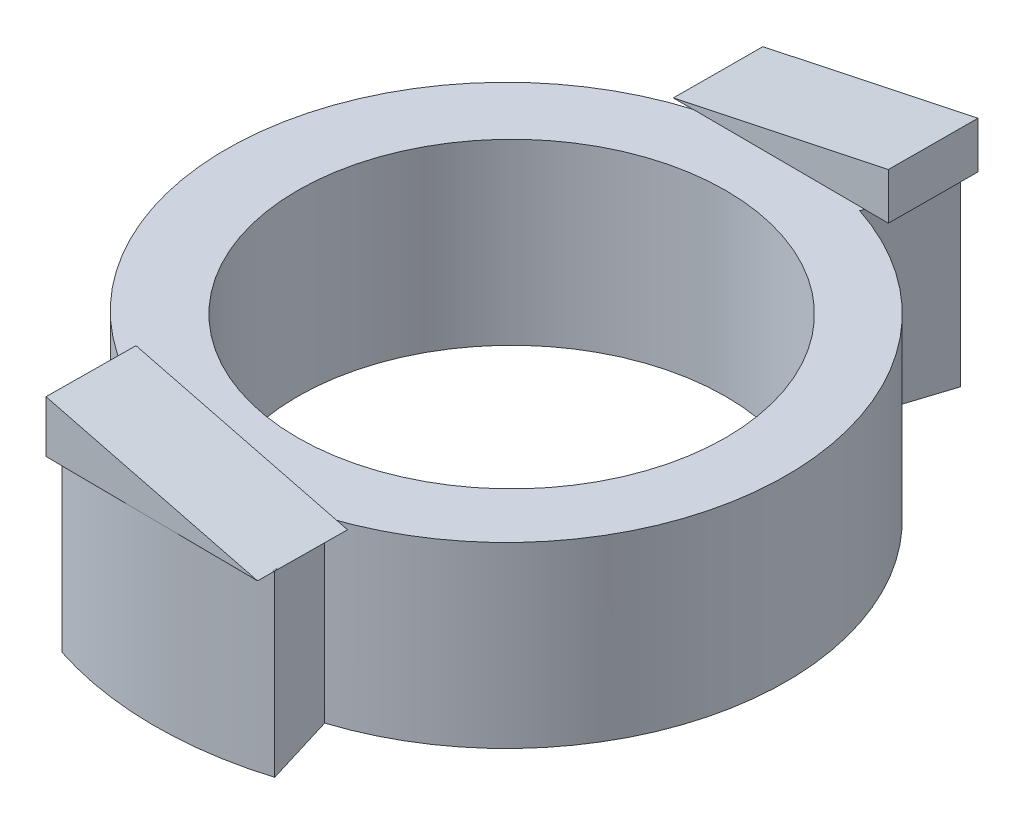
ISO-10303-21;
HEADER;
FILE_DESCRIPTION(('STEP AP214'),'2;1');
FILE_NAME('part.step','',(''),(''),'','','');
FILE_SCHEMA(('AUTOMOTIVE_DESIGN { 1 0 10303 214 1 1 1 1 }'));
ENDSEC;
DATA;
#1=APPLICATION_CONTEXT('core data for automotive mechanical design processes');
#2=APPLICATION_PROTOCOL_DEFINITION('international standard','automotive_design',2000,#1);
#3=PRODUCT_CONTEXT('',#1,'mechanical');
#4=PRODUCT('Part','Part','',(#3));
#5=PRODUCT_RELATED_PRODUCT_CATEGORY('part','',(#4));
#6=PRODUCT_DEFINITION_FORMATION('','',#4);
#7=PRODUCT_DEFINITION_CONTEXT('part definition',#1,'design');
#8=PRODUCT_DEFINITION('design','',#6,#7);
#9=PRODUCT_DEFINITION_SHAPE('','',#8);
#10=(LENGTH_UNIT() NAMED_UNIT(*) SI_UNIT(.MILLI.,.METRE.));
#11=(NAMED_UNIT(*) PLANE_ANGLE_UNIT() SI_UNIT($,.RADIAN.));
#12=(NAMED_UNIT(*) SI_UNIT($,.STERADIAN.) SOLID_ANGLE_UNIT());
#13=UNCERTAINTY_MEASURE_WITH_UNIT(LENGTH_MEASURE(1.E-05),#10,'distance_accuracy_value','');
#14=(GEOMETRIC_REPRESENTATION_CONTEXT(3) GLOBAL_UNCERTAINTY_ASSIGNED_CONTEXT((#13)) GLOBAL_UNIT_ASSIGNED_CONTEXT((#10,
#11,#12)) REPRESENTATION_CONTEXT('',''));
#15=CARTESIAN_POINT('',(0.,0.,0.));
#16=DIRECTION('',(0.,0.,1.));
#17=DIRECTION('',(1.,0.,0.));
#18=AXIS2_PLACEMENT_3D('',#15,#16,#17);
#19=CARTESIAN_POINT('',(-0.312313506761525,10.,-0.00240096295319026));
#20=DIRECTION('',(0.,1.,0.));
#21=DIRECTION('',(0.,0.,1.));
#22=AXIS2_PLACEMENT_3D('',#19,#20,#21);
#23=PLANE('',#22);
#24=CARTESIAN_POINT('',(0.,10.,0.));
#25=DIRECTION('',(0.,1.,0.));
#26=DIRECTION('',(0.,0.,1.));
#27=AXIS2_PLACEMENT_3D('',#24,#25,#26);
#28=CIRCLE('',#27,12.);
#29=CARTESIAN_POINT('',(0.,10.,12.));
#30=VERTEX_POINT('',#29);
#31=EDGE_CURVE('E313',#30,#30,#28,.T.);
#32=ORIENTED_EDGE('',*,*,#31,.F.);
#33=EDGE_LOOP('',(#32));
#34=FACE_BOUND('',#33,.T.);
#35=DIRECTION('',(0.305424491307193,0.,-0.952216299014957));
#36=VECTOR('',#35,1.);
#37=CARTESIAN_POINT('',(6.10848982614386,10.,-19.0443259802991));
#38=LINE('',#37,#36);
#39=CARTESIAN_POINT('',(4.73625087105242,10.,-14.7661219188341));
#40=VERTEX_POINT('',#39);
#41=CARTESIAN_POINT('',(4.80446415167743,10.,-14.9787892047561));
#42=VERTEX_POINT('',#41);
#43=EDGE_CURVE('E333',#40,#42,#38,.T.);
#44=ORIENTED_EDGE('',*,*,#43,.T.);
#45=DIRECTION('',(-0.999990118191045,0.,-0.00444561809660753));
#46=VECTOR('',#45,1.);
#47=CARTESIAN_POINT('',(-0.245633736556971,10.,-15.0012402331745));
#48=LINE('',#47,#46);
#49=CARTESIAN_POINT('',(-4.84503233375843,10.,-15.0216876048687));
#50=VERTEX_POINT('',#49);
#51=EDGE_CURVE('E252',#42,#50,#48,.T.);
#52=ORIENTED_EDGE('',*,*,#51,.T.);
#53=CARTESIAN_POINT('',(-0.312313506761525,10.,-0.00240096295319026));
#54=DIRECTION('',(0.,1.,0.));
#55=DIRECTION('',(0.,0.,1.));
#56=AXIS2_PLACEMENT_3D('',#53,#54,#55);
#57=CIRCLE('',#56,15.6883559112048);
#58=CARTESIAN_POINT('',(-5.04693820758331,10.,14.9544650235763));
#59=VERTEX_POINT('',#58);
#60=EDGE_CURVE('E319',#50,#59,#57,.T.);
#61=ORIENTED_EDGE('',*,*,#60,.T.);
#62=DIRECTION('',(0.999958172310143,0.,0.00914623584638644));
#63=VECTOR('',#62,1.);
#64=CARTESIAN_POINT('',(-0.449502877153635,10.,14.9965160102925));
#65=LINE('',#64,#63);
#66=CARTESIAN_POINT('',(4.75658191495235,10.,15.0441340813914));
#67=VERTEX_POINT('',#66);
#68=EDGE_CURVE('E280',#59,#67,#65,.T.);
#69=ORIENTED_EDGE('',*,*,#68,.T.);
#70=CARTESIAN_POINT('',(-0.153904493718721,10.,0.142348173982245));
#71=DIRECTION('',(0.,1.,0.));
#72=DIRECTION('',(0.,0.,-1.));
#73=AXIS2_PLACEMENT_3D('',#70,#71,#72);
#74=CIRCLE('',#73,15.69);
#75=EDGE_CURVE('E331',#67,#40,#74,.T.);
#76=ORIENTED_EDGE('',*,*,#75,.T.);
#77=EDGE_LOOP('',(#44,#52,#61,#69,#76));
#78=FACE_BOUND('',#77,.T.);
#79=ADVANCED_FACE('F35',(#34,#78),#23,.T.);
#80=DIRECTION('',(-0.00914623584638639,0.,0.999958172310143));
#81=VECTOR('',#80,1.);
#82=CARTESIAN_POINT('',(-5.97093127645346,10.,-0.05415818052419));
#83=LINE('',#82,#81);
#84=CARTESIAN_POINT('',(-6.14390272735196,10.,18.8568144651936));
#85=VERTEX_POINT('',#84);
#86=CARTESIAN_POINT('',(-6.14550885445566,10.,19.0324123778308));
#87=VERTEX_POINT('',#86);
#88=EDGE_CURVE('E307',#85,#87,#83,.T.);
#89=ORIENTED_EDGE('',*,*,#88,.F.);
#90=DIRECTION('',(-0.309790043384997,0.,0.950804990005585));
#91=VECTOR('',#90,1.);
#92=CARTESIAN_POINT('',(-6.19580086769995,10.,19.0160998001117));
#93=LINE('',#92,#91);
#94=CARTESIAN_POINT('',(-6.19580086769995,10.,19.0160998001117));
#95=VERTEX_POINT('',#94);
#96=EDGE_CURVE('E321',#85,#95,#93,.T.);
#97=ORIENTED_EDGE('',*,*,#96,.T.);
#98=CARTESIAN_POINT('',(0.,10.,0.));
#99=DIRECTION('',(0.,1.,0.));
#100=DIRECTION('',(0.,0.,1.));
#101=AXIS2_PLACEMENT_3D('',#98,#99,#100);
#102=CIRCLE('',#101,20.);
#103=EDGE_CURVE('E325',#95,#87,#102,.T.);
#104=ORIENTED_EDGE('',*,*,#103,.T.);
#105=EDGE_LOOP('',(#89,#97,#104));
#106=FACE_BOUND('',#105,.T.);
#107=ADVANCED_FACE('F448',(#106),#23,.T.);
#108=DIRECTION('',(0.00914623584638639,0.,-0.999958172310143));
#109=VECTOR('',#108,1.);
#110=CARTESIAN_POINT('',(5.93113391954824,10.,0.0547054683324496));
#111=LINE('',#110,#109);
#112=CARTESIAN_POINT('',(5.75644290922359,10.,19.153677585071));
#113=VERTEX_POINT('',#112);
#114=CARTESIAN_POINT('',(5.75931514236419,10.,18.8396562707332));
#115=VERTEX_POINT('',#114);
#116=EDGE_CURVE('E302',#113,#115,#111,.T.);
#117=ORIENTED_EDGE('',*,*,#116,.F.);
#118=CARTESIAN_POINT('',(5.8469273477541,10.,19.1262500399343));
#119=VERTEX_POINT('',#118);
#120=EDGE_CURVE('E324',#113,#119,#102,.T.);
#121=ORIENTED_EDGE('',*,*,#120,.T.);
#122=DIRECTION('',(-0.292346367387705,0.,-0.956312501996713));
#123=VECTOR('',#122,1.);
#124=CARTESIAN_POINT('',(5.8469273477541,10.,19.1262500399343));
#125=LINE('',#124,#123);
#126=EDGE_CURVE('E328',#119,#115,#125,.T.);
#127=ORIENTED_EDGE('',*,*,#126,.T.);
#128=EDGE_LOOP('',(#117,#121,#127));
#129=FACE_BOUND('',#128,.T.);
#130=ADVANCED_FACE('F480',(#129),#23,.T.);
#131=CARTESIAN_POINT('',(-0.312313506761525,0.,-0.00240096295319026));
#132=DIRECTION('',(0.,1.,0.));
#133=DIRECTION('',(0.,0.,1.));
#134=AXIS2_PLACEMENT_3D('',#131,#132,#133);
#135=PLANE('',#134);
#136=CARTESIAN_POINT('',(-0.312313506761525,0.,-0.00240096295319026));
#137=DIRECTION('',(0.,1.,0.));
#138=DIRECTION('',(0.,0.,1.));
#139=AXIS2_PLACEMENT_3D('',#136,#137,#138);
#140=CIRCLE('',#139,15.6883559112048);
#141=CARTESIAN_POINT('',(-4.65723572047331,0.,-15.0770871007615));
#142=VERTEX_POINT('',#141);
#143=CARTESIAN_POINT('',(-4.88848688461526,0.,15.0037027422881));
#144=VERTEX_POINT('',#143);
#145=EDGE_CURVE('E316',#142,#144,#140,.T.);
#146=ORIENTED_EDGE('',*,*,#145,.F.);
#147=DIRECTION('',(0.303707562580679,0.,0.952765299762383));
#148=VECTOR('',#147,1.);
#149=CARTESIAN_POINT('',(-5.93892244845055,0.,-19.0978847035814));
#150=LINE('',#149,#148);
#151=CARTESIAN_POINT('',(-5.93892244845055,0.,-19.0978847035814));
#152=VERTEX_POINT('',#151);
#153=EDGE_CURVE('E322',#152,#142,#150,.T.);
#154=ORIENTED_EDGE('',*,*,#153,.F.);
#155=CARTESIAN_POINT('',(0.,0.,0.));
#156=DIRECTION('',(0.,1.,0.));
#157=DIRECTION('',(0.,0.,1.));
#158=AXIS2_PLACEMENT_3D('',#155,#156,#157);
#159=CIRCLE('',#158,20.);
#160=CARTESIAN_POINT('',(6.10848982614386,0.,-19.0443259802991));
#161=VERTEX_POINT('',#160);
#162=EDGE_CURVE('E356',#161,#152,#159,.T.);
#163=ORIENTED_EDGE('',*,*,#162,.F.);
#164=DIRECTION('',(0.305424491307193,0.,-0.952216299014957));
#165=VECTOR('',#164,1.);
#166=CARTESIAN_POINT('',(6.10848982614386,0.,-19.0443259802991));
#167=LINE('',#166,#165);
#168=CARTESIAN_POINT('',(4.73625087105242,0.,-14.7661219188341));
#169=VERTEX_POINT('',#168);
#170=EDGE_CURVE('E353',#169,#161,#167,.T.);
#171=ORIENTED_EDGE('',*,*,#170,.F.);
#172=CARTESIAN_POINT('',(-0.153904493718721,0.,0.142348173982245));
#173=DIRECTION('',(0.,1.,0.));
#174=DIRECTION('',(0.,0.,-1.));
#175=AXIS2_PLACEMENT_3D('',#172,#173,#174);
#176=CIRCLE('',#175,15.69);
#177=CARTESIAN_POINT('',(4.61322567737798,0.,15.0906112815081));
#178=VERTEX_POINT('',#177);
#179=EDGE_CURVE('E351',#178,#169,#176,.T.);
#180=ORIENTED_EDGE('',*,*,#179,.F.);
#181=DIRECTION('',(-0.292346367387705,0.,-0.956312501996713));
#182=VECTOR('',#181,1.);
#183=CARTESIAN_POINT('',(5.8469273477541,0.,19.1262500399343));
#184=LINE('',#183,#182);
#185=CARTESIAN_POINT('',(5.8469273477541,0.,19.1262500399343));
#186=VERTEX_POINT('',#185);
#187=EDGE_CURVE('E348',#186,#178,#184,.T.);
#188=ORIENTED_EDGE('',*,*,#187,.F.);
#189=CARTESIAN_POINT('',(0.,0.,0.));
#190=DIRECTION('',(0.,1.,0.));
#191=DIRECTION('',(0.,0.,1.));
#192=AXIS2_PLACEMENT_3D('',#189,#190,#191);
#193=CIRCLE('',#192,20.);
#194=CARTESIAN_POINT('',(-6.19580086769995,0.,19.0160998001117));
#195=VERTEX_POINT('',#194);
#196=EDGE_CURVE('E346',#195,#186,#193,.T.);
#197=ORIENTED_EDGE('',*,*,#196,.F.);
#198=DIRECTION('',(-0.309790043384997,0.,0.950804990005585));
#199=VECTOR('',#198,1.);
#200=CARTESIAN_POINT('',(-6.19580086769995,0.,19.0160998001117));
#201=LINE('',#200,#199);
#202=EDGE_CURVE('E344',#144,#195,#201,.T.);
#203=ORIENTED_EDGE('',*,*,#202,.F.);
#204=EDGE_LOOP('',(#146,#154,#163,#171,#180,#188,#197,#203));
#205=FACE_BOUND('',#204,.T.);
#206=CARTESIAN_POINT('',(0.,0.,0.));
#207=DIRECTION('',(0.,1.,0.));
#208=DIRECTION('',(0.,0.,1.));
#209=AXIS2_PLACEMENT_3D('',#206,#207,#208);
#210=CIRCLE('',#209,12.);
#211=CARTESIAN_POINT('',(0.,0.,12.));
#212=VERTEX_POINT('',#211);
#213=EDGE_CURVE('E312',#212,#212,#210,.T.);
#214=ORIENTED_EDGE('',*,*,#213,.T.);
#215=EDGE_LOOP('',(#214));
#216=FACE_BOUND('',#215,.T.);
#217=ADVANCED_FACE('F433',(#205,#216),#135,.F.);
#218=CARTESIAN_POINT('',(-0.312313506761525,10.,-0.00240096295319026));
#219=DIRECTION('',(0.,-1.,0.));
#220=DIRECTION('',(0.,0.,-1.));
#221=AXIS2_PLACEMENT_3D('',#218,#219,#220);
#222=CYLINDRICAL_SURFACE('',#221,15.6883559112048);
#223=DIRECTION('',(0.,-1.,0.));
#224=VECTOR('',#223,1.);
#225=CARTESIAN_POINT('',(-4.84503233375843,10.,-15.0216876048687));
#226=LINE('',#225,#224);
#227=CARTESIAN_POINT('',(-4.84503233375843,9.99252029522689,-15.0216876048687));
#228=VERTEX_POINT('',#227);
#229=EDGE_CURVE('E255',#228,#50,#226,.F.);
#230=ORIENTED_EDGE('',*,*,#229,.F.);
#231=CARTESIAN_POINT('',(-0.312313506761525,9.99252029522689,-0.00240096295319026));
#232=DIRECTION('',(0.,-1.,0.));
#233=DIRECTION('',(0.,0.,-1.));
#234=AXIS2_PLACEMENT_3D('',#231,#232,#233);
#235=CIRCLE('',#234,15.6883559112048);
#236=CARTESIAN_POINT('',(-4.65723572047331,9.99252029522689,-15.0770871007615));
#237=VERTEX_POINT('',#236);
#238=EDGE_CURVE('E245',#228,#237,#235,.T.);
#239=ORIENTED_EDGE('',*,*,#238,.T.);
#240=DIRECTION('',(0.,-1.,0.));
#241=VECTOR('',#240,1.);
#242=CARTESIAN_POINT('',(-4.65723572047331,10.,-15.0770871007615));
#243=LINE('',#242,#241);
#244=EDGE_CURVE('E341',#237,#142,#243,.T.);
#245=ORIENTED_EDGE('',*,*,#244,.T.);
#246=ORIENTED_EDGE('',*,*,#145,.T.);
#247=DIRECTION('',(0.,-1.,0.));
#248=VECTOR('',#247,1.);
#249=CARTESIAN_POINT('',(-4.88848688461526,10.,15.0037027422881));
#250=LINE('',#249,#248);
#251=CARTESIAN_POINT('',(-4.88848688461526,9.98499083463624,15.0037027422881));
#252=VERTEX_POINT('',#251);
#253=EDGE_CURVE('E379',#252,#144,#250,.T.);
#254=ORIENTED_EDGE('',*,*,#253,.F.);
#255=CARTESIAN_POINT('',(-0.312313506761525,9.98499083463624,-0.00240096295319026));
#256=DIRECTION('',(0.,-1.,0.));
#257=DIRECTION('',(0.,0.,-1.));
#258=AXIS2_PLACEMENT_3D('',#255,#256,#257);
#259=CIRCLE('',#258,15.6883559112048);
#260=CARTESIAN_POINT('',(-5.04693820758331,9.98499083463624,14.9544650235763));
#261=VERTEX_POINT('',#260);
#262=EDGE_CURVE('E300',#252,#261,#259,.T.);
#263=ORIENTED_EDGE('',*,*,#262,.T.);
#264=DIRECTION('',(0.,-1.,0.));
#265=VECTOR('',#264,1.);
#266=CARTESIAN_POINT('',(-5.04693820758331,10.,14.9544650235763));
#267=LINE('',#266,#265);
#268=EDGE_CURVE('E290',#59,#261,#267,.T.);
#269=ORIENTED_EDGE('',*,*,#268,.F.);
#270=ORIENTED_EDGE('',*,*,#60,.F.);
#271=EDGE_LOOP('',(#230,#239,#245,#246,#254,#263,#269,#270));
#272=FACE_BOUND('',#271,.T.);
#273=ADVANCED_FACE('F37',(#272),#222,.T.);
#274=CARTESIAN_POINT('',(-6.19580086769995,10.,19.0160998001117));
#275=DIRECTION('',(0.950804990005586,0.,0.309790043384997));
#276=DIRECTION('',(0.309790043384997,0.,-0.950804990005586));
#277=AXIS2_PLACEMENT_3D('',#274,#275,#276);
#278=PLANE('',#277);
#279=ORIENTED_EDGE('',*,*,#96,.F.);
#280=DIRECTION('',(0.,-1.,0.));
#281=VECTOR('',#280,1.);
#282=CARTESIAN_POINT('',(-6.14390272735196,10.,18.8568144651936));
#283=LINE('',#282,#281);
#284=CARTESIAN_POINT('',(-6.14390272735196,9.98499083463624,18.8568144651936));
#285=VERTEX_POINT('',#284);
#286=EDGE_CURVE('E310',#85,#285,#283,.T.);
#287=ORIENTED_EDGE('',*,*,#286,.T.);
#288=DIRECTION('',(0.309790043384997,0.,-0.950804990005586));
#289=VECTOR('',#288,1.);
#290=CARTESIAN_POINT('',(-6.19580086769995,9.98499083463624,19.0160998001117));
#291=LINE('',#290,#289);
#292=EDGE_CURVE('E298',#285,#252,#291,.T.);
#293=ORIENTED_EDGE('',*,*,#292,.T.);
#294=ORIENTED_EDGE('',*,*,#253,.T.);
#295=ORIENTED_EDGE('',*,*,#202,.T.);
#296=DIRECTION('',(0.,-1.,0.));
#297=VECTOR('',#296,1.);
#298=CARTESIAN_POINT('',(-6.19580086769995,10.,19.0160998001117));
#299=LINE('',#298,#297);
#300=EDGE_CURVE('E376',#95,#195,#299,.T.);
#301=ORIENTED_EDGE('',*,*,#300,.F.);
#302=EDGE_LOOP('',(#279,#287,#293,#294,#295,#301));
#303=FACE_BOUND('',#302,.T.);
#304=ADVANCED_FACE('F440',(#303),#278,.F.);
#305=CARTESIAN_POINT('',(0.,10.,0.));
#306=DIRECTION('',(0.,-1.,0.));
#307=DIRECTION('',(0.,0.,-1.));
#308=AXIS2_PLACEMENT_3D('',#305,#306,#307);
#309=CYLINDRICAL_SURFACE('',#308,20.);
#310=ORIENTED_EDGE('',*,*,#120,.F.);
#311=CARTESIAN_POINT('',(0.,11.4378516574186,0.));
#312=DIRECTION('',(0.235580863772007,0.971852362037639,0.00215476826993311));
#313=DIRECTION('',(0.971811711698453,-0.235590717987492,0.00888879091106393));
#314=AXIS2_PLACEMENT_3D('',#311,#312,#313);
#315=ELLIPSE('',#314,20.5792574893443,20.);
#316=CARTESIAN_POINT('',(5.81853258035443,9.98499083463624,19.1349073321862));
#317=VERTEX_POINT('',#316);
#318=EDGE_CURVE('E305',#113,#317,#315,.T.);
#319=ORIENTED_EDGE('',*,*,#318,.T.);
#320=CARTESIAN_POINT('',(0.,9.98499083463624,0.));
#321=DIRECTION('',(0.,-1.,0.));
#322=DIRECTION('',(0.,0.,-1.));
#323=AXIS2_PLACEMENT_3D('',#320,#321,#322);
#324=CIRCLE('',#323,20.);
#325=CARTESIAN_POINT('',(-0.182924716927729,9.98499083463624,19.9991634462029));
#326=VERTEX_POINT('',#325);
#327=EDGE_CURVE('E297',#317,#326,#324,.T.);
#328=ORIENTED_EDGE('',*,*,#327,.T.);
#329=CARTESIAN_POINT('',(-6.14550885445566,9.98499083463624,19.0324123778308));
#330=VERTEX_POINT('',#329);
#331=EDGE_CURVE('E295',#326,#330,#324,.T.);
#332=ORIENTED_EDGE('',*,*,#331,.T.);
#333=DIRECTION('',(0.,-1.,0.));
#334=VECTOR('',#333,1.);
#335=CARTESIAN_POINT('',(-6.14550885445566,10.,19.0324123778308));
#336=LINE('',#335,#334);
#337=EDGE_CURVE('E388',#330,#87,#336,.F.);
#338=ORIENTED_EDGE('',*,*,#337,.T.);
#339=ORIENTED_EDGE('',*,*,#103,.F.);
#340=ORIENTED_EDGE('',*,*,#300,.T.);
#341=ORIENTED_EDGE('',*,*,#196,.T.);
#342=DIRECTION('',(0.,-1.,0.));
#343=VECTOR('',#342,1.);
#344=CARTESIAN_POINT('',(5.8469273477541,10.,19.1262500399343));
#345=LINE('',#344,#343);
#346=EDGE_CURVE('E373',#119,#186,#345,.T.);
#347=ORIENTED_EDGE('',*,*,#346,.F.);
#348=EDGE_LOOP('',(#310,#319,#328,#332,#338,#339,#340,#341,#347));
#349=FACE_BOUND('',#348,.T.);
#350=ADVANCED_FACE('F444',(#349),#309,.T.);
#351=CARTESIAN_POINT('',(5.8469273477541,10.,19.1262500399343));
#352=DIRECTION('',(-0.956312501996713,0.,0.292346367387705));
#353=DIRECTION('',(0.292346367387705,0.,0.956312501996713));
#354=AXIS2_PLACEMENT_3D('',#351,#352,#353);
#355=PLANE('',#354);
#356=DIRECTION('',(0.292346367387705,0.,0.956312501996713));
#357=VECTOR('',#356,1.);
#358=CARTESIAN_POINT('',(5.8469273477541,9.98499083463624,19.1262500399343));
#359=LINE('',#358,#357);
#360=CARTESIAN_POINT('',(4.61322567737798,9.98499083463624,15.0906112815081));
#361=VERTEX_POINT('',#360);
#362=CARTESIAN_POINT('',(5.8194343576586,9.98499083463624,19.036315999089));
#363=VERTEX_POINT('',#362);
#364=EDGE_CURVE('E293',#361,#363,#359,.T.);
#365=ORIENTED_EDGE('',*,*,#364,.T.);
#366=DIRECTION('',(-0.291570801501188,0.0727926063829267,-0.953775499878213));
#367=VECTOR('',#366,1.);
#368=CARTESIAN_POINT('',(5.84646311139417,9.97824292496365,19.1247314473181));
#369=LINE('',#368,#367);
#370=EDGE_CURVE('E386',#363,#115,#369,.T.);
#371=ORIENTED_EDGE('',*,*,#370,.T.);
#372=ORIENTED_EDGE('',*,*,#126,.F.);
#373=ORIENTED_EDGE('',*,*,#346,.T.);
#374=ORIENTED_EDGE('',*,*,#187,.T.);
#375=DIRECTION('',(0.,-1.,0.));
#376=VECTOR('',#375,1.);
#377=CARTESIAN_POINT('',(4.61322567737798,10.,15.0906112815081));
#378=LINE('',#377,#376);
#379=EDGE_CURVE('E371',#361,#178,#378,.T.);
#380=ORIENTED_EDGE('',*,*,#379,.F.);
#381=EDGE_LOOP('',(#365,#371,#372,#373,#374,#380));
#382=FACE_BOUND('',#381,.T.);
#383=ADVANCED_FACE('F473',(#382),#355,.F.);
#384=CARTESIAN_POINT('',(-0.153904493718721,10.,0.142348173982245));
#385=DIRECTION('',(0.,-1.,0.));
#386=DIRECTION('',(0.,0.,-1.));
#387=AXIS2_PLACEMENT_3D('',#384,#385,#386);
#388=CYLINDRICAL_SURFACE('',#387,15.69);
#389=DIRECTION('',(0.,-1.,0.));
#390=VECTOR('',#389,1.);
#391=CARTESIAN_POINT('',(4.75658191495235,10.,15.0441340813914));
#392=LINE('',#391,#390);
#393=CARTESIAN_POINT('',(4.75658191495235,9.98499083463624,15.0441340813914));
#394=VERTEX_POINT('',#393);
#395=EDGE_CURVE('E381',#394,#67,#392,.F.);
#396=ORIENTED_EDGE('',*,*,#395,.F.);
#397=CARTESIAN_POINT('',(-0.153904493718721,9.98499083463624,0.142348173982245));
#398=DIRECTION('',(0.,-1.,0.));
#399=DIRECTION('',(0.,0.,-1.));
#400=AXIS2_PLACEMENT_3D('',#397,#398,#399);
#401=CIRCLE('',#400,15.69);
#402=EDGE_CURVE('E384',#394,#361,#401,.T.);
#403=ORIENTED_EDGE('',*,*,#402,.T.);
#404=ORIENTED_EDGE('',*,*,#379,.T.);
#405=ORIENTED_EDGE('',*,*,#179,.T.);
#406=DIRECTION('',(0.,-1.,0.));
#407=VECTOR('',#406,1.);
#408=CARTESIAN_POINT('',(4.73625087105242,10.,-14.7661219188341));
#409=LINE('',#408,#407);
#410=EDGE_CURVE('E368',#40,#169,#409,.T.);
#411=ORIENTED_EDGE('',*,*,#410,.F.);
#412=ORIENTED_EDGE('',*,*,#75,.F.);
#413=EDGE_LOOP('',(#396,#403,#404,#405,#411,#412));
#414=FACE_BOUND('',#413,.T.);
#415=ADVANCED_FACE('F464',(#414),#388,.T.);
#416=CARTESIAN_POINT('',(6.10848982614386,10.,-19.0443259802991));
#417=DIRECTION('',(-0.952216299014957,0.,-0.305424491307193));
#418=DIRECTION('',(-0.305424491307193,0.,0.952216299014957));
#419=AXIS2_PLACEMENT_3D('',#416,#417,#418);
#420=PLANE('',#419);
#421=DIRECTION('',(0.,-1.,0.));
#422=VECTOR('',#421,1.);
#423=CARTESIAN_POINT('',(6.10848982614386,10.,-19.0443259802991));
#424=LINE('',#423,#422);
#425=CARTESIAN_POINT('',(6.10848982614386,9.99252029522689,-19.0443259802991));
#426=VERTEX_POINT('',#425);
#427=EDGE_CURVE('E366',#426,#161,#424,.T.);
#428=ORIENTED_EDGE('',*,*,#427,.F.);
#429=DIRECTION('',(-0.305424491307193,0.,0.952216299014957));
#430=VECTOR('',#429,1.);
#431=CARTESIAN_POINT('',(6.10848982614386,9.99252029522689,-19.0443259802991));
#432=LINE('',#431,#430);
#433=CARTESIAN_POINT('',(4.80446415167743,9.99252029522689,-14.9787892047561));
#434=VERTEX_POINT('',#433);
#435=EDGE_CURVE('E243',#426,#434,#432,.T.);
#436=ORIENTED_EDGE('',*,*,#435,.T.);
#437=DIRECTION('',(0.,-1.,0.));
#438=VECTOR('',#437,1.);
#439=CARTESIAN_POINT('',(4.80446415167743,10.,-14.9787892047561));
#440=LINE('',#439,#438);
#441=EDGE_CURVE('E11',#42,#434,#440,.T.);
#442=ORIENTED_EDGE('',*,*,#441,.F.);
#443=ORIENTED_EDGE('',*,*,#43,.F.);
#444=ORIENTED_EDGE('',*,*,#410,.T.);
#445=ORIENTED_EDGE('',*,*,#170,.T.);
#446=EDGE_LOOP('',(#428,#436,#442,#443,#444,#445));
#447=FACE_BOUND('',#446,.T.);
#448=ADVANCED_FACE('F419',(#447),#420,.F.);
#449=CARTESIAN_POINT('',(0.,10.,0.));
#450=DIRECTION('',(0.,-1.,0.));
#451=DIRECTION('',(0.,0.,-1.));
#452=AXIS2_PLACEMENT_3D('',#449,#450,#451);
#453=CYLINDRICAL_SURFACE('',#452,20.);
#454=CARTESIAN_POINT('',(0.,9.99252029522689,0.));
#455=DIRECTION('',(0.,-1.,0.));
#456=DIRECTION('',(0.,0.,-1.));
#457=AXIS2_PLACEMENT_3D('',#454,#455,#456);
#458=CIRCLE('',#457,20.);
#459=CARTESIAN_POINT('',(-5.93892244845055,9.99252029522689,-19.0978847035814));
#460=VERTEX_POINT('',#459);
#461=CARTESIAN_POINT('',(0.0889123619321518,9.99252029522689,-19.9998023638209));
#462=VERTEX_POINT('',#461);
#463=EDGE_CURVE('E50',#460,#462,#458,.T.);
#464=ORIENTED_EDGE('',*,*,#463,.T.);
#465=EDGE_CURVE('E242',#462,#426,#458,.T.);
#466=ORIENTED_EDGE('',*,*,#465,.T.);
#467=ORIENTED_EDGE('',*,*,#427,.T.);
#468=ORIENTED_EDGE('',*,*,#162,.T.);
#469=DIRECTION('',(0.,-1.,0.));
#470=VECTOR('',#469,1.);
#471=CARTESIAN_POINT('',(-5.93892244845055,10.,-19.0978847035814));
#472=LINE('',#471,#470);
#473=EDGE_CURVE('E362',#460,#152,#472,.T.);
#474=ORIENTED_EDGE('',*,*,#473,.F.);
#475=EDGE_LOOP('',(#464,#466,#467,#468,#474));
#476=FACE_BOUND('',#475,.T.);
#477=ADVANCED_FACE('F422',(#476),#453,.T.);
#478=CARTESIAN_POINT('',(-5.93892244845055,10.,-19.0978847035814));
#479=DIRECTION('',(0.952765299762383,0.,-0.303707562580679));
#480=DIRECTION('',(-0.303707562580679,0.,-0.952765299762383));
#481=AXIS2_PLACEMENT_3D('',#478,#479,#480);
#482=PLANE('',#481);
#483=ORIENTED_EDGE('',*,*,#244,.F.);
#484=DIRECTION('',(-0.303707562580679,0.,-0.952765299762383));
#485=VECTOR('',#484,1.);
#486=CARTESIAN_POINT('',(-5.93892244845055,9.99252029522689,-19.0978847035814));
#487=LINE('',#486,#485);
#488=EDGE_CURVE('E390',#237,#460,#487,.T.);
#489=ORIENTED_EDGE('',*,*,#488,.T.);
#490=ORIENTED_EDGE('',*,*,#473,.T.);
#491=ORIENTED_EDGE('',*,*,#153,.T.);
#492=EDGE_LOOP('',(#483,#489,#490,#491));
#493=FACE_BOUND('',#492,.T.);
#494=ADVANCED_FACE('F427',(#493),#482,.F.);
#495=CARTESIAN_POINT('',(0.,10.,0.));
#496=DIRECTION('',(0.,-1.,0.));
#497=DIRECTION('',(0.,0.,-1.));
#498=AXIS2_PLACEMENT_3D('',#495,#496,#497);
#499=CYLINDRICAL_SURFACE('',#498,12.);
#500=ORIENTED_EDGE('',*,*,#31,.T.);
#501=EDGE_LOOP('',(#500));
#502=FACE_BOUND('',#501,.T.);
#503=ORIENTED_EDGE('',*,*,#213,.F.);
#504=EDGE_LOOP('',(#503));
#505=FACE_BOUND('',#504,.T.);
#506=ADVANCED_FACE('F537',(#502,#505),#499,.F.);
#507=CARTESIAN_POINT('',(-6.10812064684557,12.8853491384245,14.9447587927215));
#508=DIRECTION('',(-0.999958172310143,0.,-0.00914623584638639));
#509=DIRECTION('',(-0.00914623584638639,0.,0.999958172310143));
#510=AXIS2_PLACEMENT_3D('',#507,#508,#509);
#511=PLANE('',#510);
#512=ORIENTED_EDGE('',*,*,#286,.F.);
#513=ORIENTED_EDGE('',*,*,#88,.T.);
#514=ORIENTED_EDGE('',*,*,#337,.F.);
#515=DIRECTION('',(-0.00914623584638639,0.,0.999958172310143));
#516=VECTOR('',#515,1.);
#517=CARTESIAN_POINT('',(-6.10812064684557,9.98499083463624,14.9447587927215));
#518=LINE('',#517,#516);
#519=CARTESIAN_POINT('',(-6.1538518260775,9.98499083463624,19.9445496542723));
#520=VERTEX_POINT('',#519);
#521=EDGE_CURVE('E269',#330,#520,#518,.T.);
#522=ORIENTED_EDGE('',*,*,#521,.T.);
#523=DIRECTION('',(0.,-1.,0.));
#524=VECTOR('',#523,1.);
#525=CARTESIAN_POINT('',(-6.1538518260775,12.8853491384245,19.9445496542723));
#526=LINE('',#525,#524);
#527=CARTESIAN_POINT('',(-6.1538518260775,12.8853491384245,19.9445496542723));
#528=VERTEX_POINT('',#527);
#529=EDGE_CURVE('E257',#528,#520,#526,.T.);
#530=ORIENTED_EDGE('',*,*,#529,.F.);
#531=DIRECTION('',(-0.00914623584638639,0.,0.999958172310143));
#532=VECTOR('',#531,1.);
#533=CARTESIAN_POINT('',(-6.10812064684557,12.8853491384245,14.9447587927215));
#534=LINE('',#533,#532);
#535=CARTESIAN_POINT('',(-6.10812064684557,12.8853491384245,14.9447587927215));
#536=VERTEX_POINT('',#535);
#537=EDGE_CURVE('E278',#536,#528,#534,.T.);
#538=ORIENTED_EDGE('',*,*,#537,.F.);
#539=DIRECTION('',(0.,-1.,0.));
#540=VECTOR('',#539,1.);
#541=CARTESIAN_POINT('',(-6.10812064684557,12.8853491384245,14.9447587927215));
#542=LINE('',#541,#540);
#543=CARTESIAN_POINT('',(-6.10812064684557,9.98499083463624,14.9447587927215));
#544=VERTEX_POINT('',#543);
#545=EDGE_CURVE('E258',#536,#544,#542,.T.);
#546=ORIENTED_EDGE('',*,*,#545,.T.);
#547=EDGE_CURVE('E285',#544,#285,#518,.T.);
#548=ORIENTED_EDGE('',*,*,#547,.T.);
#549=EDGE_LOOP('',(#512,#513,#514,#522,#530,#538,#546,#548));
#550=FACE_BOUND('',#549,.T.);
#551=ADVANCED_FACE('F451',(#550),#511,.T.);
#552=CARTESIAN_POINT('',(5.85585735628166,9.98499083463624,15.0541887344008));
#553=DIRECTION('',(0.235580863772007,0.971852362037639,0.00215476826993311));
#554=DIRECTION('',(-0.971854618213532,0.235581410677984,0.));
#555=AXIS2_PLACEMENT_3D('',#552,#553,#554);
#556=PLANE('',#555);
#557=ORIENTED_EDGE('',*,*,#318,.F.);
#558=ORIENTED_EDGE('',*,*,#116,.T.);
#559=ORIENTED_EDGE('',*,*,#370,.F.);
#560=DIRECTION('',(-0.00914623584638639,0.,0.999958172310143));
#561=VECTOR('',#560,1.);
#562=CARTESIAN_POINT('',(5.85585735628166,9.98499083463624,15.0541887344008));
#563=LINE('',#562,#561);
#564=CARTESIAN_POINT('',(5.85585735628166,9.98499083463624,15.0541887344008));
#565=VERTEX_POINT('',#564);
#566=EDGE_CURVE('E281',#565,#363,#563,.T.);
#567=ORIENTED_EDGE('',*,*,#566,.F.);
#568=DIRECTION('',(-0.971811711698453,0.235590717987492,-0.00888879091106398));
#569=VECTOR('',#568,1.);
#570=CARTESIAN_POINT('',(5.85585735628166,9.98499083463624,15.0541887344008));
#571=LINE('',#570,#569);
#572=EDGE_CURVE('E266',#565,#536,#571,.T.);
#573=ORIENTED_EDGE('',*,*,#572,.T.);
#574=ORIENTED_EDGE('',*,*,#537,.T.);
#575=DIRECTION('',(-0.971811711698453,0.235590717987492,-0.00888879091106398));
#576=VECTOR('',#575,1.);
#577=CARTESIAN_POINT('',(5.81012617704973,9.98499083463624,20.0539795959515));
#578=LINE('',#577,#576);
#579=CARTESIAN_POINT('',(5.81012617704973,9.98499083463624,20.0539795959515));
#580=VERTEX_POINT('',#579);
#581=EDGE_CURVE('E262',#580,#528,#578,.T.);
#582=ORIENTED_EDGE('',*,*,#581,.F.);
#583=EDGE_CURVE('E284',#317,#580,#563,.T.);
#584=ORIENTED_EDGE('',*,*,#583,.F.);
#585=EDGE_LOOP('',(#557,#558,#559,#567,#573,#574,#582,#584));
#586=FACE_BOUND('',#585,.T.);
#587=ADVANCED_FACE('F477',(#586),#556,.T.);
#588=CARTESIAN_POINT('',(-6.10812064684557,9.98499083463624,14.9447587927215));
#589=DIRECTION('',(0.,-1.,0.));
#590=DIRECTION('',(0.,0.,-1.));
#591=AXIS2_PLACEMENT_3D('',#588,#589,#590);
#592=PLANE('',#591);
#593=ORIENTED_EDGE('',*,*,#262,.F.);
#594=ORIENTED_EDGE('',*,*,#292,.F.);
#595=ORIENTED_EDGE('',*,*,#547,.F.);
#596=DIRECTION('',(0.999958172310143,0.,0.00914623584638644));
#597=VECTOR('',#596,1.);
#598=CARTESIAN_POINT('',(-6.10812064684557,9.98499083463624,14.9447587927215));
#599=LINE('',#598,#597);
#600=EDGE_CURVE('E263',#544,#261,#599,.T.);
#601=ORIENTED_EDGE('',*,*,#600,.T.);
#602=EDGE_LOOP('',(#593,#594,#595,#601));
#603=FACE_BOUND('',#602,.T.);
#604=ADVANCED_FACE('F455',(#603),#592,.T.);
#605=ORIENTED_EDGE('',*,*,#327,.F.);
#606=ORIENTED_EDGE('',*,*,#583,.T.);
#607=DIRECTION('',(0.999958172310143,0.,0.00914623584638644));
#608=VECTOR('',#607,1.);
#609=CARTESIAN_POINT('',(-6.1538518260775,9.98499083463624,19.9445496542723));
#610=LINE('',#609,#608);
#611=EDGE_CURVE('E272',#326,#580,#610,.T.);
#612=ORIENTED_EDGE('',*,*,#611,.F.);
#613=EDGE_LOOP('',(#605,#606,#612));
#614=FACE_BOUND('',#613,.T.);
#615=ADVANCED_FACE('F487',(#614),#592,.T.);
#616=ORIENTED_EDGE('',*,*,#331,.F.);
#617=EDGE_CURVE('E273',#520,#326,#610,.T.);
#618=ORIENTED_EDGE('',*,*,#617,.F.);
#619=ORIENTED_EDGE('',*,*,#521,.F.);
#620=EDGE_LOOP('',(#616,#618,#619));
#621=FACE_BOUND('',#620,.T.);
#622=ADVANCED_FACE('F495',(#621),#592,.T.);
#623=CARTESIAN_POINT('',(-0.137193537695797,0.,14.9993725846522));
#624=DIRECTION('',(-0.00914623584638644,0.,0.999958172310144));
#625=DIRECTION('',(0.999958172310143,0.,0.00914623584638644));
#626=AXIS2_PLACEMENT_3D('',#623,#624,#625);
#627=PLANE('',#626);
#628=ORIENTED_EDGE('',*,*,#68,.F.);
#629=ORIENTED_EDGE('',*,*,#268,.T.);
#630=ORIENTED_EDGE('',*,*,#600,.F.);
#631=ORIENTED_EDGE('',*,*,#545,.F.);
#632=ORIENTED_EDGE('',*,*,#572,.F.);
#633=EDGE_CURVE('E261',#394,#565,#599,.T.);
#634=ORIENTED_EDGE('',*,*,#633,.F.);
#635=ORIENTED_EDGE('',*,*,#395,.T.);
#636=EDGE_LOOP('',(#628,#629,#630,#631,#632,#634,#635));
#637=FACE_BOUND('',#636,.T.);
#638=ADVANCED_FACE('F458',(#637),#627,.F.);
#639=ORIENTED_EDGE('',*,*,#364,.F.);
#640=ORIENTED_EDGE('',*,*,#402,.F.);
#641=ORIENTED_EDGE('',*,*,#633,.T.);
#642=ORIENTED_EDGE('',*,*,#566,.T.);
#643=EDGE_LOOP('',(#639,#640,#641,#642));
#644=FACE_BOUND('',#643,.T.);
#645=ADVANCED_FACE('F469',(#644),#592,.T.);
#646=CARTESIAN_POINT('',(-0.182924716927729,0.,19.9991634462029));
#647=DIRECTION('',(-0.00914623584638644,0.,0.999958172310144));
#648=DIRECTION('',(0.999958172310143,0.,0.00914623584638644));
#649=AXIS2_PLACEMENT_3D('',#646,#647,#648);
#650=PLANE('',#649);
#651=ORIENTED_EDGE('',*,*,#617,.T.);
#652=ORIENTED_EDGE('',*,*,#611,.T.);
#653=ORIENTED_EDGE('',*,*,#581,.T.);
#654=ORIENTED_EDGE('',*,*,#529,.T.);
#655=EDGE_LOOP('',(#651,#652,#653,#654));
#656=FACE_BOUND('',#655,.T.);
#657=ADVANCED_FACE('F492',(#656),#650,.T.);
#658=CARTESIAN_POINT('',(0.0666842714491128,0.,-14.9998517728657));
#659=DIRECTION('',(0.00444561809660753,0.,-0.999990118191045));
#660=DIRECTION('',(-0.999990118191045,0.,-0.00444561809660753));
#661=AXIS2_PLACEMENT_3D('',#658,#659,#660);
#662=PLANE('',#661);
#663=DIRECTION('',(-0.999990118191044,0.,-0.00444561809660753));
#664=VECTOR('',#663,1.);
#665=CARTESIAN_POINT('',(6.14058498467379,9.99252029522689,-14.9728492631043));
#666=LINE('',#665,#664);
#667=CARTESIAN_POINT('',(-5.96928399437495,9.99252029522689,-15.026685647786));
#668=VERTEX_POINT('',#667);
#669=EDGE_CURVE('E224',#228,#668,#666,.T.);
#670=ORIENTED_EDGE('',*,*,#669,.F.);
#671=ORIENTED_EDGE('',*,*,#229,.T.);
#672=ORIENTED_EDGE('',*,*,#51,.F.);
#673=ORIENTED_EDGE('',*,*,#441,.T.);
#674=CARTESIAN_POINT('',(6.14058498467379,9.99252029522689,-14.9728492631043));
#675=VERTEX_POINT('',#674);
#676=EDGE_CURVE('E205',#675,#434,#666,.T.);
#677=ORIENTED_EDGE('',*,*,#676,.F.);
#678=DIRECTION('',(0.,-1.,0.));
#679=VECTOR('',#678,1.);
#680=CARTESIAN_POINT('',(6.14058498467379,12.600191918774,-14.9728492631043));
#681=LINE('',#680,#679);
#682=CARTESIAN_POINT('',(6.14058498467379,12.600191918774,-14.9728492631043));
#683=VERTEX_POINT('',#682);
#684=EDGE_CURVE('E221',#683,#675,#681,.T.);
#685=ORIENTED_EDGE('',*,*,#684,.F.);
#686=DIRECTION('',(0.977582648065881,0.210507193384492,0.00434600205753324));
#687=VECTOR('',#686,1.);
#688=CARTESIAN_POINT('',(-5.96928399437495,9.99252029522689,-15.026685647786));
#689=LINE('',#688,#687);
#690=EDGE_CURVE('E214',#668,#683,#689,.T.);
#691=ORIENTED_EDGE('',*,*,#690,.F.);
#692=EDGE_LOOP('',(#670,#671,#672,#673,#677,#685,#691));
#693=FACE_BOUND('',#692,.T.);
#694=ADVANCED_FACE('F219',(#693),#662,.F.);
#695=CARTESIAN_POINT('',(6.14058498467379,9.99252029522689,-14.9728492631043));
#696=DIRECTION('',(0.,-1.,0.));
#697=DIRECTION('',(0.,0.,-1.));
#698=AXIS2_PLACEMENT_3D('',#695,#696,#697);
#699=PLANE('',#698);
#700=ORIENTED_EDGE('',*,*,#238,.F.);
#701=ORIENTED_EDGE('',*,*,#669,.T.);
#702=DIRECTION('',(0.00444561809660756,0.,-0.999990118191045));
#703=VECTOR('',#702,1.);
#704=CARTESIAN_POINT('',(-5.96928399437495,9.99252029522689,-15.026685647786));
#705=LINE('',#704,#703);
#706=CARTESIAN_POINT('',(-5.94705590389192,9.99252029522689,-20.0266362387412));
#707=VERTEX_POINT('',#706);
#708=EDGE_CURVE('E213',#668,#707,#705,.T.);
#709=ORIENTED_EDGE('',*,*,#708,.T.);
#710=DIRECTION('',(-0.999990118191044,0.,-0.00444561809660753));
#711=VECTOR('',#710,1.);
#712=CARTESIAN_POINT('',(6.16281307515683,9.99252029522689,-19.9727998540596));
#713=LINE('',#712,#711);
#714=EDGE_CURVE('E236',#462,#707,#713,.T.);
#715=ORIENTED_EDGE('',*,*,#714,.F.);
#716=ORIENTED_EDGE('',*,*,#463,.F.);
#717=ORIENTED_EDGE('',*,*,#488,.F.);
#718=EDGE_LOOP('',(#700,#701,#709,#715,#716,#717));
#719=FACE_BOUND('',#718,.T.);
#720=ADVANCED_FACE('F408',(#719),#699,.T.);
#721=ORIENTED_EDGE('',*,*,#435,.F.);
#722=ORIENTED_EDGE('',*,*,#465,.F.);
#723=CARTESIAN_POINT('',(6.16281307515683,9.99252029522689,-19.9727998540596));
#724=VERTEX_POINT('',#723);
#725=EDGE_CURVE('E208',#724,#462,#713,.T.);
#726=ORIENTED_EDGE('',*,*,#725,.F.);
#727=DIRECTION('',(0.00444561809660756,0.,-0.999990118191045));
#728=VECTOR('',#727,1.);
#729=CARTESIAN_POINT('',(6.14058498467379,9.99252029522689,-14.9728492631043));
#730=LINE('',#729,#728);
#731=EDGE_CURVE('E202',#675,#724,#730,.T.);
#732=ORIENTED_EDGE('',*,*,#731,.F.);
#733=ORIENTED_EDGE('',*,*,#676,.T.);
#734=EDGE_LOOP('',(#721,#722,#726,#732,#733));
#735=FACE_BOUND('',#734,.T.);
#736=ADVANCED_FACE('F204',(#735),#699,.T.);
#737=CARTESIAN_POINT('',(6.14058498467379,12.600191918774,-14.9728492631043));
#738=DIRECTION('',(0.999990118191045,0.,0.00444561809660756));
#739=DIRECTION('',(0.00444561809660756,0.,-0.999990118191045));
#740=AXIS2_PLACEMENT_3D('',#737,#738,#739);
#741=PLANE('',#740);
#742=DIRECTION('',(0.,-1.,0.));
#743=VECTOR('',#742,1.);
#744=CARTESIAN_POINT('',(6.16281307515683,12.600191918774,-19.9727998540596));
#745=LINE('',#744,#743);
#746=CARTESIAN_POINT('',(6.16281307515683,12.600191918774,-19.9727998540596));
#747=VERTEX_POINT('',#746);
#748=EDGE_CURVE('E234',#747,#724,#745,.T.);
#749=ORIENTED_EDGE('',*,*,#748,.F.);
#750=DIRECTION('',(0.00444561809660756,0.,-0.999990118191045));
#751=VECTOR('',#750,1.);
#752=CARTESIAN_POINT('',(6.14058498467379,12.600191918774,-14.9728492631043));
#753=LINE('',#752,#751);
#754=EDGE_CURVE('E227',#683,#747,#753,.T.);
#755=ORIENTED_EDGE('',*,*,#754,.F.);
#756=ORIENTED_EDGE('',*,*,#684,.T.);
#757=ORIENTED_EDGE('',*,*,#731,.T.);
#758=EDGE_LOOP('',(#749,#755,#756,#757));
#759=FACE_BOUND('',#758,.T.);
#760=ADVANCED_FACE('F226',(#759),#741,.T.);
#761=CARTESIAN_POINT('',(-5.96928399437495,9.99252029522689,-15.026685647786));
#762=DIRECTION('',(-0.210505113192624,0.977592308446309,-0.000935834588376167));
#763=DIRECTION('',(-0.977592736527603,-0.210505205371439,0.));
#764=AXIS2_PLACEMENT_3D('',#761,#762,#763);
#765=PLANE('',#764);
#766=CARTESIAN_POINT('',(0.,11.2922720262037,0.));
#767=DIRECTION('',(-0.210505113192624,0.977592308446309,-0.000935834588376167));
#768=DIRECTION('',(-0.977582648065881,-0.210507193384492,-0.00434600205753327));
#769=AXIS2_PLACEMENT_3D('',#766,#767,#768);
#770=ELLIPSE('',#769,20.4584261017623,20.);
#771=CARTESIAN_POINT('',(-5.91641778955433,10.,-19.1048685035895));
#772=VERTEX_POINT('',#771);
#773=CARTESIAN_POINT('',(-5.93892244845055,9.99516075357199,-19.0978847035814));
#774=VERTEX_POINT('',#773);
#775=EDGE_CURVE('E248',#772,#774,#770,.T.);
#776=ORIENTED_EDGE('',*,*,#775,.F.);
#777=DIRECTION('',(-0.00444561809660756,0.,0.999990118191044));
#778=VECTOR('',#777,1.);
#779=CARTESIAN_POINT('',(-6.0012284689286,10.,-0.0276919561798251));
#780=LINE('',#779,#778);
#781=CARTESIAN_POINT('',(-5.91675795536583,10.,-19.0283521581338));
#782=VERTEX_POINT('',#781);
#783=EDGE_CURVE('E58',#772,#782,#780,.T.);
#784=ORIENTED_EDGE('',*,*,#783,.T.);
#785=DIRECTION('',(0.30304206359988,0.0661641670851045,0.950677553475973));
#786=VECTOR('',#785,1.);
#787=CARTESIAN_POINT('',(-5.93882541901553,9.99518193832658,-19.0975803111654));
#788=LINE('',#787,#786);
#789=EDGE_CURVE('E43',#774,#782,#788,.T.);
#790=ORIENTED_EDGE('',*,*,#789,.F.);
#791=EDGE_LOOP('',(#776,#784,#790));
#792=FACE_BOUND('',#791,.T.);
#793=DIRECTION('',(0.977582648065881,0.210507193384492,0.00434600205753324));
#794=VECTOR('',#793,1.);
#795=CARTESIAN_POINT('',(-5.94705590389192,9.99252029522689,-20.0266362387412));
#796=LINE('',#795,#794);
#797=EDGE_CURVE('E228',#707,#747,#796,.T.);
#798=ORIENTED_EDGE('',*,*,#797,.F.);
#799=ORIENTED_EDGE('',*,*,#708,.F.);
#800=ORIENTED_EDGE('',*,*,#690,.T.);
#801=ORIENTED_EDGE('',*,*,#754,.T.);
#802=EDGE_LOOP('',(#798,#799,#800,#801));
#803=FACE_BOUND('',#802,.T.);
#804=ADVANCED_FACE('F400',(#792,#803),#765,.T.);
#805=CARTESIAN_POINT('',(0.0889123619321506,0.,-19.9998023638209));
#806=DIRECTION('',(0.00444561809660753,0.,-0.999990118191045));
#807=DIRECTION('',(-0.999990118191045,0.,-0.00444561809660753));
#808=AXIS2_PLACEMENT_3D('',#805,#806,#807);
#809=PLANE('',#808);
#810=ORIENTED_EDGE('',*,*,#725,.T.);
#811=ORIENTED_EDGE('',*,*,#714,.T.);
#812=ORIENTED_EDGE('',*,*,#797,.T.);
#813=ORIENTED_EDGE('',*,*,#748,.T.);
#814=EDGE_LOOP('',(#810,#811,#812,#813));
#815=FACE_BOUND('',#814,.T.);
#816=ADVANCED_FACE('F403',(#815),#809,.T.);
#817=CARTESIAN_POINT('',(-5.93892244845055,10.,-19.0978847035814));
#818=VERTEX_POINT('',#817);
#819=EDGE_CURVE('E363',#818,#774,#472,.T.);
#820=ORIENTED_EDGE('',*,*,#819,.T.);
#821=ORIENTED_EDGE('',*,*,#789,.T.);
#822=DIRECTION('',(0.303707562580679,0.,0.952765299762383));
#823=VECTOR('',#822,1.);
#824=CARTESIAN_POINT('',(-5.93892244845055,10.,-19.0978847035814));
#825=LINE('',#824,#823);
#826=EDGE_CURVE('E338',#818,#782,#825,.T.);
#827=ORIENTED_EDGE('',*,*,#826,.F.);
#828=EDGE_LOOP('',(#820,#821,#827));
#829=FACE_BOUND('',#828,.T.);
#830=ADVANCED_FACE('F393',(#829),#482,.F.);
#831=CARTESIAN_POINT('',(0.,10.,0.));
#832=DIRECTION('',(0.,1.,0.));
#833=DIRECTION('',(0.,0.,1.));
#834=AXIS2_PLACEMENT_3D('',#831,#832,#833);
#835=CIRCLE('',#834,20.);
#836=EDGE_CURVE('E336',#772,#818,#835,.T.);
#837=ORIENTED_EDGE('',*,*,#836,.F.);
#838=ORIENTED_EDGE('',*,*,#775,.T.);
#839=ORIENTED_EDGE('',*,*,#819,.F.);
#840=EDGE_LOOP('',(#837,#838,#839));
#841=FACE_BOUND('',#840,.T.);
#842=ADVANCED_FACE('F399',(#841),#453,.T.);
#843=ORIENTED_EDGE('',*,*,#783,.F.);
#844=ORIENTED_EDGE('',*,*,#836,.T.);
#845=ORIENTED_EDGE('',*,*,#826,.T.);
#846=EDGE_LOOP('',(#843,#844,#845));
#847=FACE_BOUND('',#846,.T.);
#848=ADVANCED_FACE('F396',(#847),#23,.T.);
#849=CLOSED_SHELL('',(#79,#107,#130,#217,#273,#304,#350,#383,#415,#448,#477,#494,#506,#551,#587,
#604,#615,#622,#638,#645,#657,#694,#720,#736,#760,#804,#816,#830,#842,#848));
#850=MANIFOLD_SOLID_BREP('B2',#849);
#851=ADVANCED_BREP_SHAPE_REPRESENTATION('',(#18,#850),#14);
#852=SHAPE_DEFINITION_REPRESENTATION(#9,#851);
ENDSEC;
END-ISO-10303-21;
